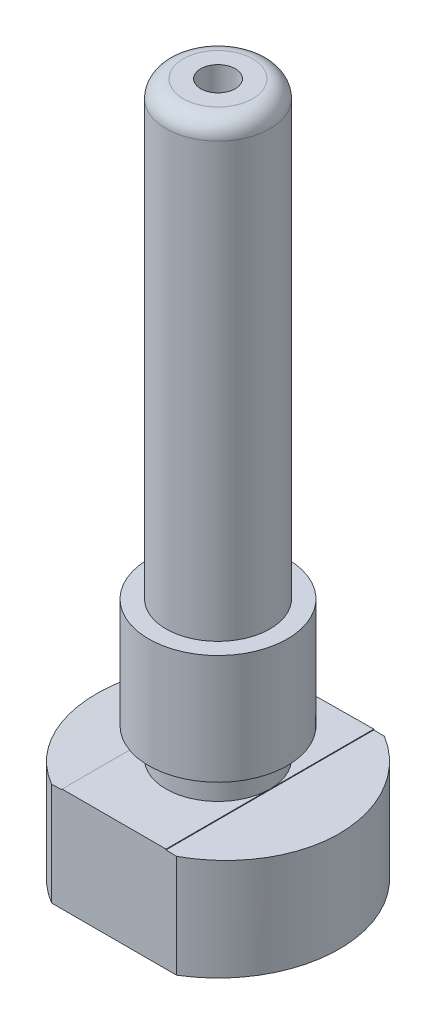
ISO-10303-21;
HEADER;
FILE_DESCRIPTION(('STEP AP214'),'2;1');
FILE_NAME('part.step','',(''),(''),'','','');
FILE_SCHEMA(('AUTOMOTIVE_DESIGN { 1 0 10303 214 1 1 1 1 }'));
ENDSEC;
DATA;
#1=APPLICATION_CONTEXT('core data for automotive mechanical design processes');
#2=APPLICATION_PROTOCOL_DEFINITION('international standard','automotive_design',2000,#1);
#3=PRODUCT_CONTEXT('',#1,'mechanical');
#4=PRODUCT('Part','Part','',(#3));
#5=PRODUCT_RELATED_PRODUCT_CATEGORY('part','',(#4));
#6=PRODUCT_DEFINITION_FORMATION('','',#4);
#7=PRODUCT_DEFINITION_CONTEXT('part definition',#1,'design');
#8=PRODUCT_DEFINITION('design','',#6,#7);
#9=PRODUCT_DEFINITION_SHAPE('','',#8);
#10=(LENGTH_UNIT() NAMED_UNIT(*) SI_UNIT(.MILLI.,.METRE.));
#11=(NAMED_UNIT(*) PLANE_ANGLE_UNIT() SI_UNIT($,.RADIAN.));
#12=(NAMED_UNIT(*) SI_UNIT($,.STERADIAN.) SOLID_ANGLE_UNIT());
#13=UNCERTAINTY_MEASURE_WITH_UNIT(LENGTH_MEASURE(1.E-05),#10,'distance_accuracy_value','');
#14=(GEOMETRIC_REPRESENTATION_CONTEXT(3) GLOBAL_UNCERTAINTY_ASSIGNED_CONTEXT((#13)) GLOBAL_UNIT_ASSIGNED_CONTEXT((#10,
#11,#12)) REPRESENTATION_CONTEXT('',''));
#15=CARTESIAN_POINT('',(0.,0.,0.));
#16=DIRECTION('',(0.,0.,1.));
#17=DIRECTION('',(1.,0.,0.));
#18=AXIS2_PLACEMENT_3D('',#15,#16,#17);
#19=CARTESIAN_POINT('',(-3.5,3.,0.));
#20=DIRECTION('',(0.,-1.,0.));
#21=DIRECTION('',(0.,0.,-1.));
#22=AXIS2_PLACEMENT_3D('',#19,#20,#21);
#23=PLANE('',#22);
#24=DIRECTION('',(1.,0.,0.));
#25=VECTOR('',#24,1.);
#26=CARTESIAN_POINT('',(-3.5,3.,3.));
#27=LINE('',#26,#25);
#28=CARTESIAN_POINT('',(-1.5,3.,3.));
#29=VERTEX_POINT('',#28);
#30=CARTESIAN_POINT('',(1.5,3.,3.));
#31=VERTEX_POINT('',#30);
#32=EDGE_CURVE('E186',#29,#31,#27,.T.);
#33=ORIENTED_EDGE('',*,*,#32,.T.);
#34=DIRECTION('',(0.,0.,-1.));
#35=VECTOR('',#34,1.);
#36=CARTESIAN_POINT('',(1.5,3.,0.));
#37=LINE('',#36,#35);
#38=CARTESIAN_POINT('',(1.5,3.,0.));
#39=VERTEX_POINT('',#38);
#40=EDGE_CURVE('E118',#31,#39,#37,.T.);
#41=ORIENTED_EDGE('',*,*,#40,.T.);
#42=CARTESIAN_POINT('',(0.,3.,0.));
#43=DIRECTION('',(0.,-1.,0.));
#44=DIRECTION('',(0.,0.,-1.));
#45=AXIS2_PLACEMENT_3D('',#42,#43,#44);
#46=CIRCLE('',#45,1.5);
#47=CARTESIAN_POINT('',(-1.5,3.,0.));
#48=VERTEX_POINT('',#47);
#49=EDGE_CURVE('E203',#39,#48,#46,.T.);
#50=ORIENTED_EDGE('',*,*,#49,.T.);
#51=DIRECTION('',(0.,0.,1.));
#52=VECTOR('',#51,1.);
#53=CARTESIAN_POINT('',(-1.5,3.,0.));
#54=LINE('',#53,#52);
#55=EDGE_CURVE('E168',#48,#29,#54,.T.);
#56=ORIENTED_EDGE('',*,*,#55,.T.);
#57=EDGE_LOOP('',(#33,#41,#50,#56));
#58=FACE_BOUND('',#57,.T.);
#59=ADVANCED_FACE('F36',(#58),#23,.F.);
#60=CARTESIAN_POINT('',(0.,7.,0.));
#61=DIRECTION('',(0.,-1.,0.));
#62=DIRECTION('',(0.,0.,-1.));
#63=AXIS2_PLACEMENT_3D('',#60,#61,#62);
#64=CYLINDRICAL_SURFACE('',#63,3.5);
#65=DIRECTION('',(0.,1.,0.));
#66=VECTOR('',#65,1.);
#67=CARTESIAN_POINT('',(-1.80277563773199,0.,3.));
#68=LINE('',#67,#66);
#69=CARTESIAN_POINT('',(-1.80277563773199,0.,3.));
#70=VERTEX_POINT('',#69);
#71=CARTESIAN_POINT('',(-1.80277563773199,2.96973076138915,3.));
#72=VERTEX_POINT('',#71);
#73=EDGE_CURVE('E183',#70,#72,#68,.T.);
#74=ORIENTED_EDGE('',*,*,#73,.T.);
#75=CARTESIAN_POINT('',(-1.80277563773199,2.96973076138915,3.));
#76=CARTESIAN_POINT('',(-1.88719275432638,2.96689625169255,2.94928246528112));
#77=CARTESIAN_POINT('',(-1.96945214494255,2.96393266944549,2.89499066303963));
#78=CARTESIAN_POINT('',(-2.12909912254278,2.9578352880283,2.7796791519754));
#79=CARTESIAN_POINT('',(-2.20648695307206,2.95470149738205,2.71865977990617));
#80=CARTESIAN_POINT('',(-2.35579614092795,2.94835331915407,2.59034888221441));
#81=CARTESIAN_POINT('',(-2.42772089909085,2.94513898339813,2.52306131769126));
#82=CARTESIAN_POINT('',(-2.56563349881162,2.93872006286565,2.38269161704181));
#83=CARTESIAN_POINT('',(-2.63162140635326,2.93551547798113,2.30960954533421));
#84=CARTESIAN_POINT('',(-2.82001955798708,2.92605065038291,2.08233815765967));
#85=CARTESIAN_POINT('',(-2.93292803497857,2.91993650292601,1.9200687410842));
#86=CARTESIAN_POINT('',(-3.12980704168069,2.90880611471092,1.57896589230389));
#87=CARTESIAN_POINT('',(-3.21378442325961,2.90378961409544,1.4001363948373));
#88=CARTESIAN_POINT('',(-3.35049660550758,2.89541847324541,1.03095690138728));
#89=CARTESIAN_POINT('',(-3.40324878967712,2.89206290851555,0.840613380601302));
#90=CARTESIAN_POINT('',(-3.47604810517626,2.88739069270717,0.453710472660888));
#91=CARTESIAN_POINT('',(-3.49608841542479,2.88607446687457,0.257149797813428));
#92=CARTESIAN_POINT('',(-3.50286618370316,2.88563184835221,-0.136176020234113));
#93=CARTESIAN_POINT('',(-3.48966623863576,2.88650133959,-0.332940082651514));
#94=CARTESIAN_POINT('',(-3.43047455018415,2.89032288788316,-0.721408753677127));
#95=CARTESIAN_POINT('',(-3.38449063605922,2.89327444771035,-0.913114558933081));
#96=CARTESIAN_POINT('',(-3.26109813330317,2.90092385573962,-1.28601024399733));
#97=CARTESIAN_POINT('',(-3.18369751487594,2.90562126100713,-1.46720277763569));
#98=CARTESIAN_POINT('',(-2.99955734416248,2.91623919343247,-1.81416268770979));
#99=CARTESIAN_POINT('',(-2.8928083021409,2.92216011605734,-1.97992505159464));
#100=CARTESIAN_POINT('',(-2.71015216799658,2.93160480597669,-2.21714949285098));
#101=CARTESIAN_POINT('',(-2.64364740504028,2.93493282288943,-2.29603359673011));
#102=CARTESIAN_POINT('',(-2.50391830431467,2.94163762597846,-2.44765349941298));
#103=CARTESIAN_POINT('',(-2.43069354502584,2.94501441520285,-2.52038891198245));
#104=CARTESIAN_POINT('',(-2.27802632500814,2.95171413309982,-2.65918222833602));
#105=CARTESIAN_POINT('',(-2.19857709911939,2.95503699829526,-2.72523268271695));
#106=CARTESIAN_POINT('',(-2.03415479115007,2.96152267800897,-2.85006827289586));
#107=CARTESIAN_POINT('',(-1.94918163213421,2.96468549029701,-2.90885330747066));
#108=CARTESIAN_POINT('',(-1.86175926379974,2.96771704147342,-2.96375647509303));
#109=B_SPLINE_CURVE_WITH_KNOTS('',3,(#75,#76,#77,#78,#79,#80,#81,#82,#83,#84,#85,#86,#87,#88,
#89,#90,#91,#92,#93,#94,#95,#96,#97,#98,#99,#100,#101,#102,#103,#104,#105,#106,#107,#108),
.UNSPECIFIED.,.F.,.F.,(4,2,2,2,2,2,2,2,2,2,2,2,2,2,2,2,4),(0.,0.295468951020843,
0.590923118833001,0.886191828830208,1.18145725672542,1.77173858067397,2.36188000965047,
2.9516925889549,3.54162814029439,4.13045357645075,4.71913844013888,5.30767405173758,
5.89640018904475,6.20575688506134,6.51513299911354,6.82485015686879,7.13457162917442),.UNSPECIFIED.);
#110=CARTESIAN_POINT('',(-1.86175926379974,2.96771704147341,-2.96375647509303));
#111=VERTEX_POINT('',#110);
#112=EDGE_CURVE('E160',#72,#111,#109,.T.);
#113=ORIENTED_EDGE('',*,*,#112,.T.);
#114=DIRECTION('',(0.,1.,0.));
#115=VECTOR('',#114,1.);
#116=CARTESIAN_POINT('',(-1.86175926379974,0.,-2.96375647509303));
#117=LINE('',#116,#115);
#118=CARTESIAN_POINT('',(-1.86175926379974,0.,-2.96375647509303));
#119=VERTEX_POINT('',#118);
#120=EDGE_CURVE('E173',#119,#111,#117,.T.);
#121=ORIENTED_EDGE('',*,*,#120,.F.);
#122=CARTESIAN_POINT('',(0.,0.,0.));
#123=DIRECTION('',(0.,-1.,0.));
#124=DIRECTION('',(0.,0.,-1.));
#125=AXIS2_PLACEMENT_3D('',#122,#123,#124);
#126=CIRCLE('',#125,3.5);
#127=EDGE_CURVE('E200',#70,#119,#126,.T.);
#128=ORIENTED_EDGE('',*,*,#127,.F.);
#129=EDGE_LOOP('',(#74,#113,#121,#128));
#130=FACE_BOUND('',#129,.T.);
#131=ADVANCED_FACE('F250',(#130),#64,.T.);
#132=CARTESIAN_POINT('',(-0.999999999999997,20.,0.));
#133=DIRECTION('',(0.,-1.,0.));
#134=DIRECTION('',(0.,0.,-1.));
#135=AXIS2_PLACEMENT_3D('',#132,#133,#134);
#136=PLANE('',#135);
#137=CARTESIAN_POINT('',(0.,20.,0.));
#138=DIRECTION('',(0.,1.,0.));
#139=DIRECTION('',(0.,0.,1.));
#140=AXIS2_PLACEMENT_3D('',#137,#138,#139);
#141=CIRCLE('',#140,0.5);
#142=CARTESIAN_POINT('',(0.,20.,0.5));
#143=VERTEX_POINT('',#142);
#144=EDGE_CURVE('E196',#143,#143,#141,.T.);
#145=ORIENTED_EDGE('',*,*,#144,.F.);
#146=EDGE_LOOP('',(#145));
#147=FACE_BOUND('',#146,.T.);
#148=CARTESIAN_POINT('',(0.,20.,0.));
#149=DIRECTION('',(0.,-1.,0.));
#150=DIRECTION('',(0.,0.,-1.));
#151=AXIS2_PLACEMENT_3D('',#148,#149,#150);
#152=CIRCLE('',#151,0.999999999999997);
#153=CARTESIAN_POINT('',(0.,20.,-0.999999999999997));
#154=VERTEX_POINT('',#153);
#155=EDGE_CURVE('E222',#154,#154,#152,.T.);
#156=ORIENTED_EDGE('',*,*,#155,.F.);
#157=EDGE_LOOP('',(#156));
#158=FACE_BOUND('',#157,.T.);
#159=ADVANCED_FACE('F38',(#147,#158),#136,.F.);
#160=CARTESIAN_POINT('',(0.,19.5,0.));
#161=DIRECTION('',(0.,-1.,0.));
#162=DIRECTION('',(0.,0.,-1.));
#163=AXIS2_PLACEMENT_3D('',#160,#161,#162);
#164=TOROIDAL_SURFACE('',#163,1.,0.5);
#165=CARTESIAN_POINT('',(0.,19.5,0.));
#166=DIRECTION('',(0.,-1.,0.));
#167=DIRECTION('',(0.,0.,-1.));
#168=AXIS2_PLACEMENT_3D('',#165,#166,#167);
#169=CIRCLE('',#168,1.5);
#170=CARTESIAN_POINT('',(0.,19.5,-1.5));
#171=VERTEX_POINT('',#170);
#172=EDGE_CURVE('E219',#171,#171,#169,.T.);
#173=ORIENTED_EDGE('',*,*,#172,.F.);
#174=EDGE_LOOP('',(#173));
#175=FACE_BOUND('',#174,.T.);
#176=ORIENTED_EDGE('',*,*,#155,.T.);
#177=EDGE_LOOP('',(#176));
#178=FACE_BOUND('',#177,.T.);
#179=ADVANCED_FACE('F284',(#175,#178),#164,.T.);
#180=CARTESIAN_POINT('',(0.,7.,0.));
#181=DIRECTION('',(0.,-1.,0.));
#182=DIRECTION('',(0.,0.,-1.));
#183=AXIS2_PLACEMENT_3D('',#180,#181,#182);
#184=CYLINDRICAL_SURFACE('',#183,1.5);
#185=CARTESIAN_POINT('',(0.,7.,0.));
#186=DIRECTION('',(0.,-1.,0.));
#187=DIRECTION('',(0.,0.,-1.));
#188=AXIS2_PLACEMENT_3D('',#185,#186,#187);
#189=CIRCLE('',#188,1.5);
#190=CARTESIAN_POINT('',(0.,7.,-1.5));
#191=VERTEX_POINT('',#190);
#192=EDGE_CURVE('E216',#191,#191,#189,.T.);
#193=ORIENTED_EDGE('',*,*,#192,.F.);
#194=EDGE_LOOP('',(#193));
#195=FACE_BOUND('',#194,.T.);
#196=ORIENTED_EDGE('',*,*,#172,.T.);
#197=EDGE_LOOP('',(#196));
#198=FACE_BOUND('',#197,.T.);
#199=ADVANCED_FACE('F281',(#195,#198),#184,.T.);
#200=CARTESIAN_POINT('',(-1.5,7.,0.));
#201=DIRECTION('',(0.,-1.,0.));
#202=DIRECTION('',(0.,0.,-1.));
#203=AXIS2_PLACEMENT_3D('',#200,#201,#202);
#204=PLANE('',#203);
#205=CARTESIAN_POINT('',(0.,7.,0.));
#206=DIRECTION('',(0.,-1.,0.));
#207=DIRECTION('',(0.,0.,-1.));
#208=AXIS2_PLACEMENT_3D('',#205,#206,#207);
#209=CIRCLE('',#208,2.);
#210=CARTESIAN_POINT('',(0.,7.,-2.));
#211=VERTEX_POINT('',#210);
#212=EDGE_CURVE('E213',#211,#211,#209,.T.);
#213=ORIENTED_EDGE('',*,*,#212,.F.);
#214=EDGE_LOOP('',(#213));
#215=FACE_BOUND('',#214,.T.);
#216=ORIENTED_EDGE('',*,*,#192,.T.);
#217=EDGE_LOOP('',(#216));
#218=FACE_BOUND('',#217,.T.);
#219=ADVANCED_FACE('F277',(#215,#218),#204,.F.);
#220=CARTESIAN_POINT('',(0.,7.,0.));
#221=DIRECTION('',(0.,-1.,0.));
#222=DIRECTION('',(0.,0.,-1.));
#223=AXIS2_PLACEMENT_3D('',#220,#221,#222);
#224=CYLINDRICAL_SURFACE('',#223,2.);
#225=CARTESIAN_POINT('',(0.,3.83320908074124,0.));
#226=DIRECTION('',(0.,-1.,0.));
#227=DIRECTION('',(0.,0.,-1.));
#228=AXIS2_PLACEMENT_3D('',#225,#226,#227);
#229=CIRCLE('',#228,2.);
#230=CARTESIAN_POINT('',(0.,3.83320908074124,-2.));
#231=VERTEX_POINT('',#230);
#232=EDGE_CURVE('E210',#231,#231,#229,.T.);
#233=ORIENTED_EDGE('',*,*,#232,.F.);
#234=EDGE_LOOP('',(#233));
#235=FACE_BOUND('',#234,.T.);
#236=ORIENTED_EDGE('',*,*,#212,.T.);
#237=EDGE_LOOP('',(#236));
#238=FACE_BOUND('',#237,.T.);
#239=ADVANCED_FACE('F273',(#235,#238),#224,.T.);
#240=CARTESIAN_POINT('',(-1.5,3.83320908074124,0.));
#241=DIRECTION('',(0.,1.,0.));
#242=DIRECTION('',(0.,0.,1.));
#243=AXIS2_PLACEMENT_3D('',#240,#241,#242);
#244=PLANE('',#243);
#245=CARTESIAN_POINT('',(0.,3.83320908074124,0.));
#246=DIRECTION('',(0.,-1.,0.));
#247=DIRECTION('',(0.,0.,-1.));
#248=AXIS2_PLACEMENT_3D('',#245,#246,#247);
#249=CIRCLE('',#248,1.5);
#250=CARTESIAN_POINT('',(0.,3.83320908074124,-1.5));
#251=VERTEX_POINT('',#250);
#252=EDGE_CURVE('E207',#251,#251,#249,.T.);
#253=ORIENTED_EDGE('',*,*,#252,.F.);
#254=EDGE_LOOP('',(#253));
#255=FACE_BOUND('',#254,.T.);
#256=ORIENTED_EDGE('',*,*,#232,.T.);
#257=EDGE_LOOP('',(#256));
#258=FACE_BOUND('',#257,.T.);
#259=ADVANCED_FACE('F270',(#255,#258),#244,.F.);
#260=CARTESIAN_POINT('',(0.,7.,0.));
#261=DIRECTION('',(0.,-1.,0.));
#262=DIRECTION('',(0.,0.,-1.));
#263=AXIS2_PLACEMENT_3D('',#260,#261,#262);
#264=CYLINDRICAL_SURFACE('',#263,1.5);
#265=ORIENTED_EDGE('',*,*,#49,.F.);
#266=EDGE_CURVE('E204',#48,#39,#46,.T.);
#267=ORIENTED_EDGE('',*,*,#266,.F.);
#268=EDGE_LOOP('',(#265,#267));
#269=FACE_BOUND('',#268,.T.);
#270=ORIENTED_EDGE('',*,*,#252,.T.);
#271=EDGE_LOOP('',(#270));
#272=FACE_BOUND('',#271,.T.);
#273=ADVANCED_FACE('F237',(#269,#272),#264,.T.);
#274=ORIENTED_EDGE('',*,*,#266,.T.);
#275=CARTESIAN_POINT('',(1.5,3.,-2.99700544362048));
#276=VERTEX_POINT('',#275);
#277=EDGE_CURVE('E112',#39,#276,#37,.T.);
#278=ORIENTED_EDGE('',*,*,#277,.T.);
#279=DIRECTION('',(-0.999951094097558,0.,0.00988986415971316));
#280=VECTOR('',#279,1.);
#281=CARTESIAN_POINT('',(-3.52914948008803,3.,-2.94726540584208));
#282=LINE('',#281,#280);
#283=CARTESIAN_POINT('',(-1.5,3.,-2.96733440005218));
#284=VERTEX_POINT('',#283);
#285=EDGE_CURVE('E59',#276,#284,#282,.T.);
#286=ORIENTED_EDGE('',*,*,#285,.T.);
#287=EDGE_CURVE('E169',#284,#48,#54,.T.);
#288=ORIENTED_EDGE('',*,*,#287,.T.);
#289=EDGE_LOOP('',(#274,#278,#286,#288));
#290=FACE_BOUND('',#289,.T.);
#291=ADVANCED_FACE('F233',(#290),#23,.F.);
#292=DIRECTION('',(0.,1.,0.));
#293=VECTOR('',#292,1.);
#294=CARTESIAN_POINT('',(1.80277563773199,0.,-3.));
#295=LINE('',#294,#293);
#296=CARTESIAN_POINT('',(1.80277563773199,0.,-3.));
#297=VERTEX_POINT('',#296);
#298=CARTESIAN_POINT('',(1.80277563773199,2.96973076138913,-3.));
#299=VERTEX_POINT('',#298);
#300=EDGE_CURVE('E174',#297,#299,#295,.T.);
#301=ORIENTED_EDGE('',*,*,#300,.T.);
#302=CARTESIAN_POINT('',(1.80277563773199,2.96973076138914,-3.));
#303=CARTESIAN_POINT('',(1.88719271275798,2.96689625308663,-2.94928249022028));
#304=CARTESIAN_POINT('',(1.96945206391243,2.96393267236367,-2.89499071650034));
#305=CARTESIAN_POINT('',(2.12909896782429,2.95783529411319,-2.77967926878498));
#306=CARTESIAN_POINT('',(2.20648676411678,2.95470150510922,-2.71865993152907));
#307=CARTESIAN_POINT('',(2.35579596267501,2.94835332703979,-2.59034904614976));
#308=CARTESIAN_POINT('',(2.42772076046063,2.94513898971918,-2.52306145293422));
#309=CARTESIAN_POINT('',(2.56563343385723,2.93872006602011,-2.38269168901884));
#310=CARTESIAN_POINT('',(2.6316213754488,2.93551547953367,-2.30960958273459));
#311=CARTESIAN_POINT('',(2.82001966102774,2.92605064520636,-2.08233803311968));
#312=CARTESIAN_POINT('',(2.93292822016179,2.91993649289818,-1.92006847363791));
#313=CARTESIAN_POINT('',(3.12980718061518,2.90880610641209,-1.57896559813283));
#314=CARTESIAN_POINT('',(3.21378448123889,2.90378961057775,-1.40013624408655));
#315=CARTESIAN_POINT('',(3.35049638682668,2.89541848660317,-1.03095748610216));
#316=CARTESIAN_POINT('',(3.40324844857906,2.89206293007007,-0.840614584661916));
#317=CARTESIAN_POINT('',(3.47604798278311,2.88739070090089,-0.453711732124647));
#318=CARTESIAN_POINT('',(3.49608842656718,2.88607446645219,-0.25715045414616));
#319=CARTESIAN_POINT('',(3.50286620556665,2.88563184661972,0.136178589516855));
#320=CARTESIAN_POINT('',(3.48966581505416,2.88650136637992,0.332945279799505));
#321=CARTESIAN_POINT('',(3.43047343943087,2.89032296016743,0.72141362728122));
#322=CARTESIAN_POINT('',(3.38449013056411,2.89327448317485,0.913116610709694));
#323=CARTESIAN_POINT('',(3.26110077379882,2.90092368792231,1.28600174033885));
#324=CARTESIAN_POINT('',(3.18370378379641,2.90562086628299,1.46718690207444));
#325=CARTESIAN_POINT('',(2.99956863380432,2.91623857554601,1.81414547564684));
#326=CARTESIAN_POINT('',(2.89281819912285,2.92215961797222,1.97991240116591));
#327=CARTESIAN_POINT('',(2.70665713860834,2.93178551759026,2.22168854546097));
#328=CARTESIAN_POINT('',(2.63624588475117,2.93530287437465,2.30479145474844));
#329=CARTESIAN_POINT('',(2.48796606197311,2.94238563507441,2.46411323306141));
#330=CARTESIAN_POINT('',(2.41009653940372,2.94595104508388,2.54033121932149));
#331=CARTESIAN_POINT('',(2.24745553945686,2.95301077935057,2.68529875825934));
#332=CARTESIAN_POINT('',(2.16267240806442,2.95650497062876,2.75403522457313));
#333=CARTESIAN_POINT('',(1.98706740075765,2.96329590290726,2.88330985247154));
#334=CARTESIAN_POINT('',(1.89624569062893,2.96659264932359,2.94384823899115));
#335=CARTESIAN_POINT('',(1.80277563773199,2.96973076138914,3.));
#336=B_SPLINE_CURVE_WITH_KNOTS('',3,(#302,#303,#304,#305,#306,#307,#308,#309,#310,#311,#312,
#313,#314,#315,#316,#317,#318,#319,#320,#321,#322,#323,#324,#325,#326,#327,#328,#329,#330,#331,
#332,#333,#334,#335),.UNSPECIFIED.,.F.,.F.,(4,2,2,2,2,2,2,2,2,2,2,2,2,2,2,2,4),(0.,
0.295468805575426,0.590922828549531,0.886191683608821,1.18145725672586,1.77173906492386,
2.36188000965221,2.95169071769424,3.54162814028687,4.13046118080927,4.71913844009589,
5.30764607922054,5.8964001890578,6.22292975506654,6.54950112852528,6.87663484578104,
7.2037595854795),.UNSPECIFIED.);
#337=CARTESIAN_POINT('',(1.80277563773199,2.96973076138914,3.));
#338=VERTEX_POINT('',#337);
#339=EDGE_CURVE('E131',#299,#338,#336,.T.);
#340=ORIENTED_EDGE('',*,*,#339,.T.);
#341=DIRECTION('',(0.,1.,0.));
#342=VECTOR('',#341,1.);
#343=CARTESIAN_POINT('',(1.80277563773199,0.,3.));
#344=LINE('',#343,#342);
#345=CARTESIAN_POINT('',(1.80277563773199,0.,3.));
#346=VERTEX_POINT('',#345);
#347=EDGE_CURVE('E127',#346,#338,#344,.T.);
#348=ORIENTED_EDGE('',*,*,#347,.F.);
#349=EDGE_CURVE('E199',#297,#346,#126,.T.);
#350=ORIENTED_EDGE('',*,*,#349,.F.);
#351=EDGE_LOOP('',(#301,#340,#348,#350));
#352=FACE_BOUND('',#351,.T.);
#353=ADVANCED_FACE('F140',(#352),#64,.T.);
#354=CARTESIAN_POINT('',(0.,0.,0.));
#355=DIRECTION('',(0.,1.,0.));
#356=DIRECTION('',(0.,0.,1.));
#357=AXIS2_PLACEMENT_3D('',#354,#355,#356);
#358=PLANE('',#357);
#359=CARTESIAN_POINT('',(0.,0.,0.));
#360=DIRECTION('',(0.,-1.,0.));
#361=DIRECTION('',(0.,0.,-1.));
#362=AXIS2_PLACEMENT_3D('',#359,#360,#361);
#363=CIRCLE('',#362,0.999999999999989);
#364=CARTESIAN_POINT('',(0.,0.,-0.999999999999989));
#365=VERTEX_POINT('',#364);
#366=EDGE_CURVE('E189',#365,#365,#363,.T.);
#367=ORIENTED_EDGE('',*,*,#366,.F.);
#368=EDGE_LOOP('',(#367));
#369=FACE_BOUND('',#368,.T.);
#370=ORIENTED_EDGE('',*,*,#127,.T.);
#371=DIRECTION('',(0.999951094097558,0.,-0.00988986415971316));
#372=VECTOR('',#371,1.);
#373=CARTESIAN_POINT('',(-1.86175926379974,0.,-2.96375647509303));
#374=LINE('',#373,#372);
#375=EDGE_CURVE('E167',#119,#297,#374,.T.);
#376=ORIENTED_EDGE('',*,*,#375,.T.);
#377=ORIENTED_EDGE('',*,*,#349,.T.);
#378=DIRECTION('',(-1.,0.,0.));
#379=VECTOR('',#378,1.);
#380=CARTESIAN_POINT('',(1.80277563773199,0.,3.));
#381=LINE('',#380,#379);
#382=EDGE_CURVE('E180',#346,#70,#381,.T.);
#383=ORIENTED_EDGE('',*,*,#382,.T.);
#384=EDGE_LOOP('',(#370,#376,#377,#383));
#385=FACE_BOUND('',#384,.T.);
#386=ADVANCED_FACE('F253',(#369,#385),#358,.F.);
#387=CARTESIAN_POINT('',(0.,0.,0.));
#388=DIRECTION('',(0.,1.,0.));
#389=DIRECTION('',(0.,0.,1.));
#390=AXIS2_PLACEMENT_3D('',#387,#388,#389);
#391=CYLINDRICAL_SURFACE('',#390,0.5);
#392=CARTESIAN_POINT('',(0.,2.30043030951378,0.));
#393=DIRECTION('',(0.,-1.,0.));
#394=DIRECTION('',(0.,0.,-1.));
#395=AXIS2_PLACEMENT_3D('',#392,#393,#394);
#396=CIRCLE('',#395,0.5);
#397=CARTESIAN_POINT('',(0.,2.30043030951378,-0.5));
#398=VERTEX_POINT('',#397);
#399=EDGE_CURVE('E195',#398,#398,#396,.T.);
#400=ORIENTED_EDGE('',*,*,#399,.T.);
#401=EDGE_LOOP('',(#400));
#402=FACE_BOUND('',#401,.T.);
#403=ORIENTED_EDGE('',*,*,#144,.T.);
#404=EDGE_LOOP('',(#403));
#405=FACE_BOUND('',#404,.T.);
#406=ADVANCED_FACE('F261',(#402,#405),#391,.F.);
#407=CARTESIAN_POINT('',(0.,2.,0.));
#408=DIRECTION('',(0.,-1.,0.));
#409=DIRECTION('',(0.,0.,-1.));
#410=AXIS2_PLACEMENT_3D('',#407,#408,#409);
#411=CONICAL_SURFACE('',#410,0.999999999999999,1.02974425867665);
#412=CARTESIAN_POINT('',(0.,2.,0.));
#413=DIRECTION('',(0.,-1.,0.));
#414=DIRECTION('',(0.,0.,-1.));
#415=AXIS2_PLACEMENT_3D('',#412,#413,#414);
#416=CIRCLE('',#415,0.999999999999999);
#417=CARTESIAN_POINT('',(0.,2.,-0.999999999999999));
#418=VERTEX_POINT('',#417);
#419=EDGE_CURVE('E192',#418,#418,#416,.T.);
#420=ORIENTED_EDGE('',*,*,#419,.T.);
#421=EDGE_LOOP('',(#420));
#422=FACE_BOUND('',#421,.T.);
#423=ORIENTED_EDGE('',*,*,#399,.F.);
#424=EDGE_LOOP('',(#423));
#425=FACE_BOUND('',#424,.T.);
#426=ADVANCED_FACE('F302',(#422,#425),#411,.F.);
#427=CARTESIAN_POINT('',(0.,0.,0.));
#428=DIRECTION('',(0.,-1.,0.));
#429=DIRECTION('',(0.,0.,-1.));
#430=AXIS2_PLACEMENT_3D('',#427,#428,#429);
#431=CYLINDRICAL_SURFACE('',#430,0.999999999999994);
#432=ORIENTED_EDGE('',*,*,#419,.F.);
#433=EDGE_LOOP('',(#432));
#434=FACE_BOUND('',#433,.T.);
#435=ORIENTED_EDGE('',*,*,#366,.T.);
#436=EDGE_LOOP('',(#435));
#437=FACE_BOUND('',#436,.T.);
#438=ADVANCED_FACE('F308',(#434,#437),#431,.F.);
#439=CARTESIAN_POINT('',(1.80277563773199,0.,3.));
#440=DIRECTION('',(0.,0.,-1.));
#441=DIRECTION('',(-1.,0.,0.));
#442=AXIS2_PLACEMENT_3D('',#439,#440,#441);
#443=PLANE('',#442);
#444=ORIENTED_EDGE('',*,*,#347,.T.);
#445=CARTESIAN_POINT('',(0.,-50.7,3.));
#446=DIRECTION('',(0.,0.,-1.));
#447=DIRECTION('',(1.,0.,0.));
#448=AXIS2_PLACEMENT_3D('',#445,#446,#447);
#449=CIRCLE('',#448,53.7);
#450=CARTESIAN_POINT('',(1.5,2.9790461912281,3.));
#451=VERTEX_POINT('',#450);
#452=EDGE_CURVE('E109',#451,#338,#449,.T.);
#453=ORIENTED_EDGE('',*,*,#452,.F.);
#454=DIRECTION('',(0.,-1.,0.));
#455=VECTOR('',#454,1.);
#456=CARTESIAN_POINT('',(1.5,3.41660454037062,3.));
#457=LINE('',#456,#455);
#458=EDGE_CURVE('E113',#31,#451,#457,.T.);
#459=ORIENTED_EDGE('',*,*,#458,.F.);
#460=ORIENTED_EDGE('',*,*,#32,.F.);
#461=DIRECTION('',(0.,1.,0.));
#462=VECTOR('',#461,1.);
#463=CARTESIAN_POINT('',(-1.5,3.41660454037062,3.));
#464=LINE('',#463,#462);
#465=CARTESIAN_POINT('',(-1.5,2.9790461912281,3.));
#466=VERTEX_POINT('',#465);
#467=EDGE_CURVE('E244',#466,#29,#464,.T.);
#468=ORIENTED_EDGE('',*,*,#467,.F.);
#469=CARTESIAN_POINT('',(0.,-50.7,3.));
#470=DIRECTION('',(0.,0.,-1.));
#471=DIRECTION('',(1.,0.,0.));
#472=AXIS2_PLACEMENT_3D('',#469,#470,#471);
#473=CIRCLE('',#472,53.7);
#474=EDGE_CURVE('E138',#72,#466,#473,.T.);
#475=ORIENTED_EDGE('',*,*,#474,.F.);
#476=ORIENTED_EDGE('',*,*,#73,.F.);
#477=ORIENTED_EDGE('',*,*,#382,.F.);
#478=EDGE_LOOP('',(#444,#453,#459,#460,#468,#475,#476,#477));
#479=FACE_BOUND('',#478,.T.);
#480=ADVANCED_FACE('F124',(#479),#443,.F.);
#481=CARTESIAN_POINT('',(-1.86175926379974,0.,-2.96375647509303));
#482=DIRECTION('',(0.00988986415971316,0.,0.999951094097558));
#483=DIRECTION('',(0.999951094097558,0.,-0.00988986415971316));
#484=AXIS2_PLACEMENT_3D('',#481,#482,#483);
#485=PLANE('',#484);
#486=DIRECTION('',(0.,-1.,0.));
#487=VECTOR('',#486,1.);
#488=CARTESIAN_POINT('',(1.5,0.,-2.99700544362048));
#489=LINE('',#488,#487);
#490=CARTESIAN_POINT('',(1.5,2.9790461912281,-2.99700544362048));
#491=VERTEX_POINT('',#490);
#492=EDGE_CURVE('E44',#276,#491,#489,.T.);
#493=ORIENTED_EDGE('',*,*,#492,.T.);
#494=CARTESIAN_POINT('',(0.,-50.7,-2.98216992183633));
#495=DIRECTION('',(0.00988986415971316,0.,0.999951094097558));
#496=DIRECTION('',(-0.999951094097558,0.,0.00988986415971316));
#497=AXIS2_PLACEMENT_3D('',#494,#495,#496);
#498=ELLIPSE('',#497,53.7026263754064,53.7);
#499=EDGE_CURVE('E11',#491,#299,#498,.F.);
#500=ORIENTED_EDGE('',*,*,#499,.T.);
#501=ORIENTED_EDGE('',*,*,#300,.F.);
#502=ORIENTED_EDGE('',*,*,#375,.F.);
#503=ORIENTED_EDGE('',*,*,#120,.T.);
#504=CARTESIAN_POINT('',(0.,-50.7,-2.98216992183633));
#505=DIRECTION('',(0.00988986415971316,0.,0.999951094097558));
#506=DIRECTION('',(-0.999951094097558,0.,0.00988986415971316));
#507=AXIS2_PLACEMENT_3D('',#504,#505,#506);
#508=ELLIPSE('',#507,53.7026263754064,53.7);
#509=CARTESIAN_POINT('',(-1.5,2.9790461912281,-2.96733440005218));
#510=VERTEX_POINT('',#509);
#511=EDGE_CURVE('E230',#111,#510,#508,.F.);
#512=ORIENTED_EDGE('',*,*,#511,.T.);
#513=DIRECTION('',(0.,1.,0.));
#514=VECTOR('',#513,1.);
#515=CARTESIAN_POINT('',(-1.5,0.,-2.96733440005218));
#516=LINE('',#515,#514);
#517=EDGE_CURVE('E225',#510,#284,#516,.T.);
#518=ORIENTED_EDGE('',*,*,#517,.T.);
#519=ORIENTED_EDGE('',*,*,#285,.F.);
#520=EDGE_LOOP('',(#493,#500,#501,#502,#503,#512,#518,#519));
#521=FACE_BOUND('',#520,.T.);
#522=ADVANCED_FACE('F156',(#521),#485,.F.);
#523=CARTESIAN_POINT('',(0.,-50.7,-7.));
#524=DIRECTION('',(0.,0.,1.));
#525=DIRECTION('',(1.,0.,0.));
#526=AXIS2_PLACEMENT_3D('',#523,#524,#525);
#527=CYLINDRICAL_SURFACE('',#526,53.7);
#528=ORIENTED_EDGE('',*,*,#474,.T.);
#529=DIRECTION('',(0.,0.,1.));
#530=VECTOR('',#529,1.);
#531=CARTESIAN_POINT('',(-1.5,2.9790461912281,-7.));
#532=LINE('',#531,#530);
#533=EDGE_CURVE('E245',#510,#466,#532,.T.);
#534=ORIENTED_EDGE('',*,*,#533,.F.);
#535=ORIENTED_EDGE('',*,*,#511,.F.);
#536=ORIENTED_EDGE('',*,*,#112,.F.);
#537=EDGE_LOOP('',(#528,#534,#535,#536));
#538=FACE_BOUND('',#537,.T.);
#539=ADVANCED_FACE('F151',(#538),#527,.T.);
#540=CARTESIAN_POINT('',(-1.5,3.41660454037062,-7.));
#541=DIRECTION('',(1.,0.,0.));
#542=DIRECTION('',(0.,0.,-1.));
#543=AXIS2_PLACEMENT_3D('',#540,#541,#542);
#544=PLANE('',#543);
#545=ORIENTED_EDGE('',*,*,#287,.F.);
#546=ORIENTED_EDGE('',*,*,#517,.F.);
#547=ORIENTED_EDGE('',*,*,#533,.T.);
#548=ORIENTED_EDGE('',*,*,#467,.T.);
#549=ORIENTED_EDGE('',*,*,#55,.F.);
#550=EDGE_LOOP('',(#545,#546,#547,#548,#549));
#551=FACE_BOUND('',#550,.T.);
#552=ADVANCED_FACE('F148',(#551),#544,.F.);
#553=CARTESIAN_POINT('',(0.,-50.7,-7.));
#554=DIRECTION('',(0.,0.,1.));
#555=DIRECTION('',(1.,0.,0.));
#556=AXIS2_PLACEMENT_3D('',#553,#554,#555);
#557=CYLINDRICAL_SURFACE('',#556,53.7);
#558=ORIENTED_EDGE('',*,*,#499,.F.);
#559=DIRECTION('',(0.,0.,1.));
#560=VECTOR('',#559,1.);
#561=CARTESIAN_POINT('',(1.5,2.9790461912281,-7.));
#562=LINE('',#561,#560);
#563=EDGE_CURVE('E51',#491,#451,#562,.T.);
#564=ORIENTED_EDGE('',*,*,#563,.T.);
#565=ORIENTED_EDGE('',*,*,#452,.T.);
#566=ORIENTED_EDGE('',*,*,#339,.F.);
#567=EDGE_LOOP('',(#558,#564,#565,#566));
#568=FACE_BOUND('',#567,.T.);
#569=ADVANCED_FACE('F107',(#568),#557,.T.);
#570=CARTESIAN_POINT('',(1.5,3.41660454037062,-7.));
#571=DIRECTION('',(-1.,0.,0.));
#572=DIRECTION('',(0.,0.,1.));
#573=AXIS2_PLACEMENT_3D('',#570,#571,#572);
#574=PLANE('',#573);
#575=ORIENTED_EDGE('',*,*,#458,.T.);
#576=ORIENTED_EDGE('',*,*,#563,.F.);
#577=ORIENTED_EDGE('',*,*,#492,.F.);
#578=ORIENTED_EDGE('',*,*,#277,.F.);
#579=ORIENTED_EDGE('',*,*,#40,.F.);
#580=EDGE_LOOP('',(#575,#576,#577,#578,#579));
#581=FACE_BOUND('',#580,.T.);
#582=ADVANCED_FACE('F116',(#581),#574,.F.);
#583=CLOSED_SHELL('',(#59,#131,#159,#179,#199,#219,#239,#259,#273,#291,#353,#386,#406,#426,#438,
#480,#522,#539,#552,#569,#582));
#584=MANIFOLD_SOLID_BREP('B2',#583);
#585=ADVANCED_BREP_SHAPE_REPRESENTATION('',(#18,#584),#14);
#586=SHAPE_DEFINITION_REPRESENTATION(#9,#585);
ENDSEC;
END-ISO-10303-21;
